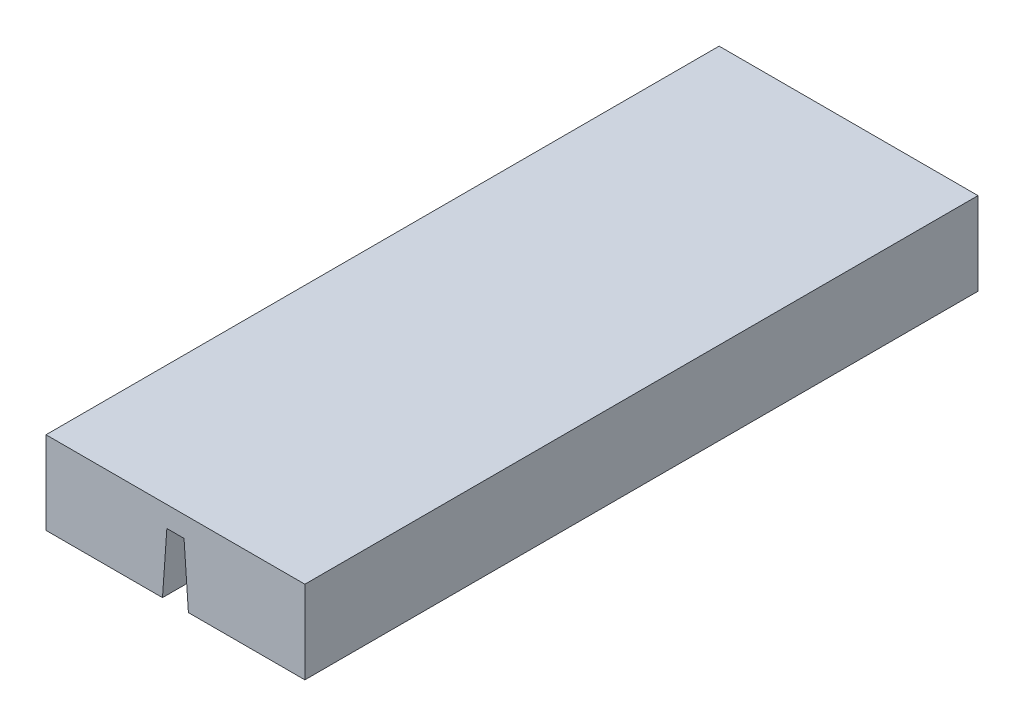
ISO-10303-21;
HEADER;
FILE_DESCRIPTION(('STEP AP214'),'2;1');
FILE_NAME('part.step','',(''),(''),'','','');
FILE_SCHEMA(('AUTOMOTIVE_DESIGN { 1 0 10303 214 1 1 1 1 }'));
ENDSEC;
DATA;
#1=APPLICATION_CONTEXT('core data for automotive mechanical design processes');
#2=APPLICATION_PROTOCOL_DEFINITION('international standard','automotive_design',2000,#1);
#3=PRODUCT_CONTEXT('',#1,'mechanical');
#4=PRODUCT('Part','Part','',(#3));
#5=PRODUCT_RELATED_PRODUCT_CATEGORY('part','',(#4));
#6=PRODUCT_DEFINITION_FORMATION('','',#4);
#7=PRODUCT_DEFINITION_CONTEXT('part definition',#1,'design');
#8=PRODUCT_DEFINITION('design','',#6,#7);
#9=PRODUCT_DEFINITION_SHAPE('','',#8);
#10=(LENGTH_UNIT() NAMED_UNIT(*) SI_UNIT(.MILLI.,.METRE.));
#11=(NAMED_UNIT(*) PLANE_ANGLE_UNIT() SI_UNIT($,.RADIAN.));
#12=(NAMED_UNIT(*) SI_UNIT($,.STERADIAN.) SOLID_ANGLE_UNIT());
#13=UNCERTAINTY_MEASURE_WITH_UNIT(LENGTH_MEASURE(1.E-05),#10,'distance_accuracy_value','');
#14=(GEOMETRIC_REPRESENTATION_CONTEXT(3) GLOBAL_UNCERTAINTY_ASSIGNED_CONTEXT((#13)) GLOBAL_UNIT_ASSIGNED_CONTEXT((#10,
#11,#12)) REPRESENTATION_CONTEXT('',''));
#15=CARTESIAN_POINT('',(0.,0.,0.));
#16=DIRECTION('',(0.,0.,1.));
#17=DIRECTION('',(1.,0.,0.));
#18=AXIS2_PLACEMENT_3D('',#15,#16,#17);
#19=CARTESIAN_POINT('',(0.,16.,130.));
#20=DIRECTION('',(0.,0.,-1.));
#21=DIRECTION('',(-1.,0.,0.));
#22=AXIS2_PLACEMENT_3D('',#19,#20,#21);
#23=PLANE('',#22);
#24=DIRECTION('',(0.0697564737441176,0.997564050259825,0.));
#25=VECTOR('',#24,1.);
#26=CARTESIAN_POINT('',(22.5,0.,130.));
#27=LINE('',#26,#25);
#28=CARTESIAN_POINT('',(22.5,0.,130.));
#29=VERTEX_POINT('',#28);
#30=CARTESIAN_POINT('',(23.3387913292404,11.9952748584922,130.));
#31=VERTEX_POINT('',#30);
#32=EDGE_CURVE('E122',#29,#31,#27,.T.);
#33=ORIENTED_EDGE('',*,*,#32,.T.);
#34=DIRECTION('',(1.,0.,0.));
#35=VECTOR('',#34,1.);
#36=CARTESIAN_POINT('',(23.3387913292404,11.9952748584922,130.));
#37=LINE('',#36,#35);
#38=CARTESIAN_POINT('',(26.6612086707596,11.9952748584922,130.));
#39=VERTEX_POINT('',#38);
#40=EDGE_CURVE('E131',#31,#39,#37,.T.);
#41=ORIENTED_EDGE('',*,*,#40,.T.);
#42=DIRECTION('',(-0.0697564737441182,0.997564050259825,0.));
#43=VECTOR('',#42,1.);
#44=CARTESIAN_POINT('',(27.5,0.,130.));
#45=LINE('',#44,#43);
#46=CARTESIAN_POINT('',(27.5,0.,130.));
#47=VERTEX_POINT('',#46);
#48=EDGE_CURVE('E136',#47,#39,#45,.T.);
#49=ORIENTED_EDGE('',*,*,#48,.F.);
#50=DIRECTION('',(1.,0.,0.));
#51=VECTOR('',#50,1.);
#52=CARTESIAN_POINT('',(0.,0.,130.));
#53=LINE('',#52,#51);
#54=CARTESIAN_POINT('',(50.,0.,130.));
#55=VERTEX_POINT('',#54);
#56=EDGE_CURVE('E167',#47,#55,#53,.T.);
#57=ORIENTED_EDGE('',*,*,#56,.T.);
#58=DIRECTION('',(0.,-1.,0.));
#59=VECTOR('',#58,1.);
#60=CARTESIAN_POINT('',(50.,16.,130.));
#61=LINE('',#60,#59);
#62=CARTESIAN_POINT('',(50.,16.,130.));
#63=VERTEX_POINT('',#62);
#64=EDGE_CURVE('E182',#63,#55,#61,.T.);
#65=ORIENTED_EDGE('',*,*,#64,.F.);
#66=DIRECTION('',(1.,0.,0.));
#67=VECTOR('',#66,1.);
#68=CARTESIAN_POINT('',(0.,16.,130.));
#69=LINE('',#68,#67);
#70=CARTESIAN_POINT('',(0.,16.,130.));
#71=VERTEX_POINT('',#70);
#72=EDGE_CURVE('E97',#71,#63,#69,.T.);
#73=ORIENTED_EDGE('',*,*,#72,.F.);
#74=DIRECTION('',(0.,-1.,0.));
#75=VECTOR('',#74,1.);
#76=CARTESIAN_POINT('',(0.,16.,130.));
#77=LINE('',#76,#75);
#78=CARTESIAN_POINT('',(0.,0.,130.));
#79=VERTEX_POINT('',#78);
#80=EDGE_CURVE('E186',#71,#79,#77,.T.);
#81=ORIENTED_EDGE('',*,*,#80,.T.);
#82=EDGE_CURVE('E139',#79,#29,#53,.T.);
#83=ORIENTED_EDGE('',*,*,#82,.T.);
#84=EDGE_LOOP('',(#33,#41,#49,#57,#65,#73,#81,#83));
#85=FACE_BOUND('',#84,.T.);
#86=ADVANCED_FACE('F43',(#85),#23,.F.);
#87=CARTESIAN_POINT('',(0.,16.,0.));
#88=DIRECTION('',(0.,0.,1.));
#89=DIRECTION('',(1.,0.,0.));
#90=AXIS2_PLACEMENT_3D('',#87,#88,#89);
#91=PLANE('',#90);
#92=DIRECTION('',(0.0697564737441176,0.997564050259825,0.));
#93=VECTOR('',#92,1.);
#94=CARTESIAN_POINT('',(23.5039005810231,14.356447164132,0.));
#95=LINE('',#94,#93);
#96=CARTESIAN_POINT('',(22.5,0.,0.));
#97=VERTEX_POINT('',#96);
#98=CARTESIAN_POINT('',(23.3387913292404,11.9952748584922,0.));
#99=VERTEX_POINT('',#98);
#100=EDGE_CURVE('E124',#97,#99,#95,.T.);
#101=ORIENTED_EDGE('',*,*,#100,.F.);
#102=DIRECTION('',(-1.,0.,0.));
#103=VECTOR('',#102,1.);
#104=CARTESIAN_POINT('',(0.,0.,0.));
#105=LINE('',#104,#103);
#106=CARTESIAN_POINT('',(0.,0.,0.));
#107=VERTEX_POINT('',#106);
#108=EDGE_CURVE('E89',#97,#107,#105,.T.);
#109=ORIENTED_EDGE('',*,*,#108,.T.);
#110=DIRECTION('',(0.,-1.,0.));
#111=VECTOR('',#110,1.);
#112=CARTESIAN_POINT('',(0.,16.,0.));
#113=LINE('',#112,#111);
#114=CARTESIAN_POINT('',(0.,16.,0.));
#115=VERTEX_POINT('',#114);
#116=EDGE_CURVE('E163',#115,#107,#113,.T.);
#117=ORIENTED_EDGE('',*,*,#116,.F.);
#118=DIRECTION('',(-1.,0.,0.));
#119=VECTOR('',#118,1.);
#120=CARTESIAN_POINT('',(0.,16.,0.));
#121=LINE('',#120,#119);
#122=CARTESIAN_POINT('',(50.,16.,0.));
#123=VERTEX_POINT('',#122);
#124=EDGE_CURVE('E68',#123,#115,#121,.T.);
#125=ORIENTED_EDGE('',*,*,#124,.F.);
#126=DIRECTION('',(0.,-1.,0.));
#127=VECTOR('',#126,1.);
#128=CARTESIAN_POINT('',(50.,16.,0.));
#129=LINE('',#128,#127);
#130=CARTESIAN_POINT('',(50.,0.,0.));
#131=VERTEX_POINT('',#130);
#132=EDGE_CURVE('E178',#123,#131,#129,.T.);
#133=ORIENTED_EDGE('',*,*,#132,.T.);
#134=CARTESIAN_POINT('',(27.5,0.,0.));
#135=VERTEX_POINT('',#134);
#136=EDGE_CURVE('E155',#131,#135,#105,.T.);
#137=ORIENTED_EDGE('',*,*,#136,.T.);
#138=DIRECTION('',(-0.0697564737441182,0.997564050259825,0.));
#139=VECTOR('',#138,1.);
#140=CARTESIAN_POINT('',(26.2528011375162,17.8357746881333,0.));
#141=LINE('',#140,#139);
#142=CARTESIAN_POINT('',(26.6612086707596,11.9952748584922,0.));
#143=VERTEX_POINT('',#142);
#144=EDGE_CURVE('E59',#135,#143,#141,.T.);
#145=ORIENTED_EDGE('',*,*,#144,.T.);
#146=DIRECTION('',(1.,0.,0.));
#147=VECTOR('',#146,1.);
#148=CARTESIAN_POINT('',(0.,11.9952748584922,0.));
#149=LINE('',#148,#147);
#150=EDGE_CURVE('E11',#99,#143,#149,.T.);
#151=ORIENTED_EDGE('',*,*,#150,.F.);
#152=EDGE_LOOP('',(#101,#109,#117,#125,#133,#137,#145,#151));
#153=FACE_BOUND('',#152,.T.);
#154=ADVANCED_FACE('F193',(#153),#91,.F.);
#155=CARTESIAN_POINT('',(0.,0.,0.));
#156=DIRECTION('',(0.,1.,0.));
#157=DIRECTION('',(0.,0.,1.));
#158=AXIS2_PLACEMENT_3D('',#155,#156,#157);
#159=PLANE('',#158);
#160=DIRECTION('',(0.,0.,-1.));
#161=VECTOR('',#160,1.);
#162=CARTESIAN_POINT('',(22.5,0.,0.));
#163=LINE('',#162,#161);
#164=EDGE_CURVE('E52',#29,#97,#163,.T.);
#165=ORIENTED_EDGE('',*,*,#164,.F.);
#166=ORIENTED_EDGE('',*,*,#82,.F.);
#167=DIRECTION('',(0.,0.,1.));
#168=VECTOR('',#167,1.);
#169=CARTESIAN_POINT('',(0.,0.,0.));
#170=LINE('',#169,#168);
#171=EDGE_CURVE('E151',#107,#79,#170,.T.);
#172=ORIENTED_EDGE('',*,*,#171,.F.);
#173=ORIENTED_EDGE('',*,*,#108,.F.);
#174=EDGE_LOOP('',(#165,#166,#172,#173));
#175=FACE_BOUND('',#174,.T.);
#176=ADVANCED_FACE('F195',(#175),#159,.F.);
#177=CARTESIAN_POINT('',(0.,16.,0.));
#178=DIRECTION('',(1.,0.,0.));
#179=DIRECTION('',(0.,0.,-1.));
#180=AXIS2_PLACEMENT_3D('',#177,#178,#179);
#181=PLANE('',#180);
#182=ORIENTED_EDGE('',*,*,#171,.T.);
#183=ORIENTED_EDGE('',*,*,#80,.F.);
#184=DIRECTION('',(0.,0.,1.));
#185=VECTOR('',#184,1.);
#186=CARTESIAN_POINT('',(0.,16.,0.));
#187=LINE('',#186,#185);
#188=EDGE_CURVE('E152',#115,#71,#187,.T.);
#189=ORIENTED_EDGE('',*,*,#188,.F.);
#190=ORIENTED_EDGE('',*,*,#116,.T.);
#191=EDGE_LOOP('',(#182,#183,#189,#190));
#192=FACE_BOUND('',#191,.T.);
#193=ADVANCED_FACE('F45',(#192),#181,.F.);
#194=CARTESIAN_POINT('',(50.,16.,0.));
#195=DIRECTION('',(-1.,0.,0.));
#196=DIRECTION('',(0.,0.,1.));
#197=AXIS2_PLACEMENT_3D('',#194,#195,#196);
#198=PLANE('',#197);
#199=DIRECTION('',(0.,0.,-1.));
#200=VECTOR('',#199,1.);
#201=CARTESIAN_POINT('',(50.,0.,0.));
#202=LINE('',#201,#200);
#203=EDGE_CURVE('E170',#55,#131,#202,.T.);
#204=ORIENTED_EDGE('',*,*,#203,.T.);
#205=ORIENTED_EDGE('',*,*,#132,.F.);
#206=DIRECTION('',(0.,0.,-1.));
#207=VECTOR('',#206,1.);
#208=CARTESIAN_POINT('',(50.,16.,0.));
#209=LINE('',#208,#207);
#210=EDGE_CURVE('E158',#63,#123,#209,.T.);
#211=ORIENTED_EDGE('',*,*,#210,.F.);
#212=ORIENTED_EDGE('',*,*,#64,.T.);
#213=EDGE_LOOP('',(#204,#205,#211,#212));
#214=FACE_BOUND('',#213,.T.);
#215=ADVANCED_FACE('F203',(#214),#198,.F.);
#216=CARTESIAN_POINT('',(0.,16.,0.));
#217=DIRECTION('',(0.,1.,0.));
#218=DIRECTION('',(0.,0.,1.));
#219=AXIS2_PLACEMENT_3D('',#216,#217,#218);
#220=PLANE('',#219);
#221=ORIENTED_EDGE('',*,*,#188,.T.);
#222=ORIENTED_EDGE('',*,*,#72,.T.);
#223=ORIENTED_EDGE('',*,*,#210,.T.);
#224=ORIENTED_EDGE('',*,*,#124,.T.);
#225=EDGE_LOOP('',(#221,#222,#223,#224));
#226=FACE_BOUND('',#225,.T.);
#227=ADVANCED_FACE('F210',(#226),#220,.T.);
#228=ORIENTED_EDGE('',*,*,#56,.F.);
#229=DIRECTION('',(0.,0.,-1.));
#230=VECTOR('',#229,1.);
#231=CARTESIAN_POINT('',(27.5,0.,0.));
#232=LINE('',#231,#230);
#233=EDGE_CURVE('E189',#47,#135,#232,.T.);
#234=ORIENTED_EDGE('',*,*,#233,.T.);
#235=ORIENTED_EDGE('',*,*,#136,.F.);
#236=ORIENTED_EDGE('',*,*,#203,.F.);
#237=EDGE_LOOP('',(#228,#234,#235,#236));
#238=FACE_BOUND('',#237,.T.);
#239=ADVANCED_FACE('F206',(#238),#159,.F.);
#240=CARTESIAN_POINT('',(23.3387913292404,11.9952748584922,-37.));
#241=DIRECTION('',(0.,-1.,0.));
#242=DIRECTION('',(0.,0.,-1.));
#243=AXIS2_PLACEMENT_3D('',#240,#241,#242);
#244=PLANE('',#243);
#245=ORIENTED_EDGE('',*,*,#150,.T.);
#246=DIRECTION('',(0.,0.,1.));
#247=VECTOR('',#246,1.);
#248=CARTESIAN_POINT('',(26.6612086707596,11.9952748584922,-37.));
#249=LINE('',#248,#247);
#250=EDGE_CURVE('E128',#143,#39,#249,.T.);
#251=ORIENTED_EDGE('',*,*,#250,.T.);
#252=ORIENTED_EDGE('',*,*,#40,.F.);
#253=DIRECTION('',(0.,0.,1.));
#254=VECTOR('',#253,1.);
#255=CARTESIAN_POINT('',(23.3387913292404,11.9952748584922,-37.));
#256=LINE('',#255,#254);
#257=EDGE_CURVE('E118',#99,#31,#256,.T.);
#258=ORIENTED_EDGE('',*,*,#257,.F.);
#259=EDGE_LOOP('',(#245,#251,#252,#258));
#260=FACE_BOUND('',#259,.T.);
#261=ADVANCED_FACE('F132',(#260),#244,.T.);
#262=CARTESIAN_POINT('',(22.5,0.,-37.));
#263=DIRECTION('',(0.997564050259825,-0.0697564737441176,0.));
#264=DIRECTION('',(0.0697564737441176,0.997564050259825,0.));
#265=AXIS2_PLACEMENT_3D('',#262,#263,#264);
#266=PLANE('',#265);
#267=ORIENTED_EDGE('',*,*,#100,.T.);
#268=ORIENTED_EDGE('',*,*,#257,.T.);
#269=ORIENTED_EDGE('',*,*,#32,.F.);
#270=ORIENTED_EDGE('',*,*,#164,.T.);
#271=EDGE_LOOP('',(#267,#268,#269,#270));
#272=FACE_BOUND('',#271,.T.);
#273=ADVANCED_FACE('F120',(#272),#266,.T.);
#274=CARTESIAN_POINT('',(27.5,0.,-37.));
#275=DIRECTION('',(0.997564050259825,0.0697564737441181,0.));
#276=DIRECTION('',(-0.0697564737441182,0.997564050259825,0.));
#277=AXIS2_PLACEMENT_3D('',#274,#275,#276);
#278=PLANE('',#277);
#279=ORIENTED_EDGE('',*,*,#233,.F.);
#280=ORIENTED_EDGE('',*,*,#48,.T.);
#281=ORIENTED_EDGE('',*,*,#250,.F.);
#282=ORIENTED_EDGE('',*,*,#144,.F.);
#283=EDGE_LOOP('',(#279,#280,#281,#282));
#284=FACE_BOUND('',#283,.T.);
#285=ADVANCED_FACE('F281',(#284),#278,.F.);
#286=CLOSED_SHELL('',(#86,#154,#176,#193,#215,#227,#239,#261,#273,#285));
#287=MANIFOLD_SOLID_BREP('B2',#286);
#288=ADVANCED_BREP_SHAPE_REPRESENTATION('',(#18,#287),#14);
#289=SHAPE_DEFINITION_REPRESENTATION(#9,#288);
ENDSEC;
END-ISO-10303-21;
